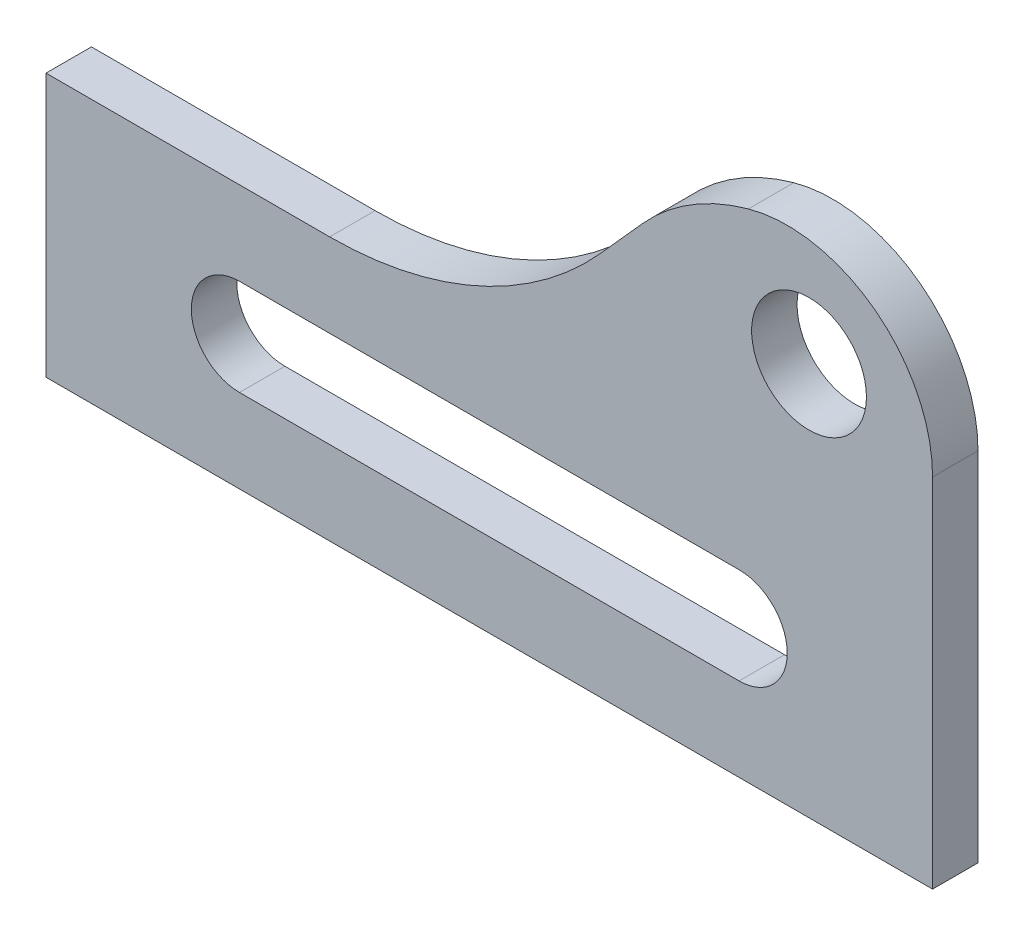
ISO-10303-21;
HEADER;
FILE_DESCRIPTION(('STEP AP214'),'2;1');
FILE_NAME('part.step','',(''),(''),'','','');
FILE_SCHEMA(('AUTOMOTIVE_DESIGN { 1 0 10303 214 1 1 1 1 }'));
ENDSEC;
DATA;
#1=APPLICATION_CONTEXT('core data for automotive mechanical design processes');
#2=APPLICATION_PROTOCOL_DEFINITION('international standard','automotive_design',2000,#1);
#3=PRODUCT_CONTEXT('',#1,'mechanical');
#4=PRODUCT('Part','Part','',(#3));
#5=PRODUCT_RELATED_PRODUCT_CATEGORY('part','',(#4));
#6=PRODUCT_DEFINITION_FORMATION('','',#4);
#7=PRODUCT_DEFINITION_CONTEXT('part definition',#1,'design');
#8=PRODUCT_DEFINITION('design','',#6,#7);
#9=PRODUCT_DEFINITION_SHAPE('','',#8);
#10=(LENGTH_UNIT() NAMED_UNIT(*) SI_UNIT(.MILLI.,.METRE.));
#11=(NAMED_UNIT(*) PLANE_ANGLE_UNIT() SI_UNIT($,.RADIAN.));
#12=(NAMED_UNIT(*) SI_UNIT($,.STERADIAN.) SOLID_ANGLE_UNIT());
#13=UNCERTAINTY_MEASURE_WITH_UNIT(LENGTH_MEASURE(1.E-05),#10,'distance_accuracy_value','');
#14=(GEOMETRIC_REPRESENTATION_CONTEXT(3) GLOBAL_UNCERTAINTY_ASSIGNED_CONTEXT((#13)) GLOBAL_UNIT_ASSIGNED_CONTEXT((#10,
#11,#12)) REPRESENTATION_CONTEXT('',''));
#15=CARTESIAN_POINT('',(0.,0.,0.));
#16=DIRECTION('',(0.,0.,1.));
#17=DIRECTION('',(1.,0.,0.));
#18=AXIS2_PLACEMENT_3D('',#15,#16,#17);
#19=CARTESIAN_POINT('',(0.,9.2075,1.5875));
#20=DIRECTION('',(0.,-1.,0.));
#21=DIRECTION('',(0.,0.,-1.));
#22=AXIS2_PLACEMENT_3D('',#19,#20,#21);
#23=PLANE('',#22);
#24=DIRECTION('',(-1.,0.,0.));
#25=VECTOR('',#24,1.);
#26=CARTESIAN_POINT('',(0.,9.2075,1.5875));
#27=LINE('',#26,#25);
#28=CARTESIAN_POINT('',(9.91586112190986,9.2075,1.5875));
#29=VERTEX_POINT('',#28);
#30=CARTESIAN_POINT('',(0.,9.2075,1.5875));
#31=VERTEX_POINT('',#30);
#32=EDGE_CURVE('E184',#29,#31,#27,.T.);
#33=ORIENTED_EDGE('',*,*,#32,.F.);
#34=DIRECTION('',(0.,0.,1.));
#35=VECTOR('',#34,1.);
#36=CARTESIAN_POINT('',(9.91586112190987,9.2075,1.5875));
#37=LINE('',#36,#35);
#38=CARTESIAN_POINT('',(9.91586112190986,9.2075,0.));
#39=VERTEX_POINT('',#38);
#40=EDGE_CURVE('E194',#29,#39,#37,.F.);
#41=ORIENTED_EDGE('',*,*,#40,.T.);
#42=DIRECTION('',(-1.,0.,0.));
#43=VECTOR('',#42,1.);
#44=CARTESIAN_POINT('',(0.,9.2075,0.));
#45=LINE('',#44,#43);
#46=CARTESIAN_POINT('',(0.,9.2075,0.));
#47=VERTEX_POINT('',#46);
#48=EDGE_CURVE('E179',#39,#47,#45,.T.);
#49=ORIENTED_EDGE('',*,*,#48,.T.);
#50=DIRECTION('',(0.,0.,-1.));
#51=VECTOR('',#50,1.);
#52=CARTESIAN_POINT('',(0.,9.2075,1.5875));
#53=LINE('',#52,#51);
#54=EDGE_CURVE('E191',#31,#47,#53,.T.);
#55=ORIENTED_EDGE('',*,*,#54,.F.);
#56=EDGE_LOOP('',(#33,#41,#49,#55));
#57=FACE_BOUND('',#56,.T.);
#58=ADVANCED_FACE('F35',(#57),#23,.F.);
#59=CARTESIAN_POINT('',(0.,0.,1.5875));
#60=DIRECTION('',(1.,0.,0.));
#61=DIRECTION('',(0.,0.,-1.));
#62=AXIS2_PLACEMENT_3D('',#59,#60,#61);
#63=PLANE('',#62);
#64=DIRECTION('',(0.,-1.,0.));
#65=VECTOR('',#64,1.);
#66=CARTESIAN_POINT('',(0.,0.,0.));
#67=LINE('',#66,#65);
#68=CARTESIAN_POINT('',(0.,0.,0.));
#69=VERTEX_POINT('',#68);
#70=EDGE_CURVE('E163',#47,#69,#67,.T.);
#71=ORIENTED_EDGE('',*,*,#70,.T.);
#72=DIRECTION('',(0.,0.,-1.));
#73=VECTOR('',#72,1.);
#74=CARTESIAN_POINT('',(0.,0.,1.5875));
#75=LINE('',#74,#73);
#76=CARTESIAN_POINT('',(0.,0.,1.5875));
#77=VERTEX_POINT('',#76);
#78=EDGE_CURVE('E235',#77,#69,#75,.T.);
#79=ORIENTED_EDGE('',*,*,#78,.F.);
#80=DIRECTION('',(0.,-1.,0.));
#81=VECTOR('',#80,1.);
#82=CARTESIAN_POINT('',(0.,0.,1.5875));
#83=LINE('',#82,#81);
#84=EDGE_CURVE('E175',#31,#77,#83,.T.);
#85=ORIENTED_EDGE('',*,*,#84,.F.);
#86=ORIENTED_EDGE('',*,*,#54,.T.);
#87=EDGE_LOOP('',(#71,#79,#85,#86));
#88=FACE_BOUND('',#87,.T.);
#89=ADVANCED_FACE('F265',(#88),#63,.F.);
#90=CARTESIAN_POINT('',(0.,0.,1.5875));
#91=DIRECTION('',(0.,1.,0.));
#92=DIRECTION('',(0.,0.,1.));
#93=AXIS2_PLACEMENT_3D('',#90,#91,#92);
#94=PLANE('',#93);
#95=DIRECTION('',(1.,0.,0.));
#96=VECTOR('',#95,1.);
#97=CARTESIAN_POINT('',(0.,0.,0.));
#98=LINE('',#97,#96);
#99=CARTESIAN_POINT('',(30.988,0.,0.));
#100=VERTEX_POINT('',#99);
#101=EDGE_CURVE('E234',#69,#100,#98,.T.);
#102=ORIENTED_EDGE('',*,*,#101,.T.);
#103=DIRECTION('',(0.,0.,-1.));
#104=VECTOR('',#103,1.);
#105=CARTESIAN_POINT('',(30.988,0.,1.5875));
#106=LINE('',#105,#104);
#107=CARTESIAN_POINT('',(30.988,0.,1.5875));
#108=VERTEX_POINT('',#107);
#109=EDGE_CURVE('E232',#108,#100,#106,.T.);
#110=ORIENTED_EDGE('',*,*,#109,.F.);
#111=DIRECTION('',(1.,0.,0.));
#112=VECTOR('',#111,1.);
#113=CARTESIAN_POINT('',(0.,0.,1.5875));
#114=LINE('',#113,#112);
#115=EDGE_CURVE('E178',#77,#108,#114,.T.);
#116=ORIENTED_EDGE('',*,*,#115,.F.);
#117=ORIENTED_EDGE('',*,*,#78,.T.);
#118=EDGE_LOOP('',(#102,#110,#116,#117));
#119=FACE_BOUND('',#118,.T.);
#120=ADVANCED_FACE('F233',(#119),#94,.F.);
#121=CARTESIAN_POINT('',(30.988,0.,1.5875));
#122=DIRECTION('',(-1.,0.,0.));
#123=DIRECTION('',(0.,0.,1.));
#124=AXIS2_PLACEMENT_3D('',#121,#122,#123);
#125=PLANE('',#124);
#126=DIRECTION('',(0.,1.,0.));
#127=VECTOR('',#126,1.);
#128=CARTESIAN_POINT('',(30.988,0.,0.));
#129=LINE('',#128,#127);
#130=CARTESIAN_POINT('',(30.988,12.4764438348202,0.));
#131=VERTEX_POINT('',#130);
#132=EDGE_CURVE('E223',#100,#131,#129,.T.);
#133=ORIENTED_EDGE('',*,*,#132,.T.);
#134=DIRECTION('',(0.,0.,-1.));
#135=VECTOR('',#134,1.);
#136=CARTESIAN_POINT('',(30.988,12.4764438348202,1.5875));
#137=LINE('',#136,#135);
#138=CARTESIAN_POINT('',(30.988,12.4764438348202,1.5875));
#139=VERTEX_POINT('',#138);
#140=EDGE_CURVE('E201',#131,#139,#137,.F.);
#141=ORIENTED_EDGE('',*,*,#140,.T.);
#142=DIRECTION('',(0.,1.,0.));
#143=VECTOR('',#142,1.);
#144=CARTESIAN_POINT('',(30.988,0.,1.5875));
#145=LINE('',#144,#143);
#146=EDGE_CURVE('E181',#108,#139,#145,.T.);
#147=ORIENTED_EDGE('',*,*,#146,.F.);
#148=ORIENTED_EDGE('',*,*,#109,.T.);
#149=EDGE_LOOP('',(#133,#141,#147,#148));
#150=FACE_BOUND('',#149,.T.);
#151=ADVANCED_FACE('F221',(#150),#125,.F.);
#152=CARTESIAN_POINT('',(0.,0.,1.5875));
#153=DIRECTION('',(0.,0.,-1.));
#154=DIRECTION('',(-1.,0.,0.));
#155=AXIS2_PLACEMENT_3D('',#152,#153,#154);
#156=PLANE('',#155);
#157=DIRECTION('',(1.,0.,0.));
#158=VECTOR('',#157,1.);
#159=CARTESIAN_POINT('',(6.76275,2.921,1.5875));
#160=LINE('',#159,#158);
#161=CARTESIAN_POINT('',(6.76275,2.921,1.5875));
#162=VERTEX_POINT('',#161);
#163=CARTESIAN_POINT('',(24.22525,2.921,1.5875));
#164=VERTEX_POINT('',#163);
#165=EDGE_CURVE('E150',#162,#164,#160,.T.);
#166=ORIENTED_EDGE('',*,*,#165,.F.);
#167=CARTESIAN_POINT('',(6.76275,4.60375,1.5875));
#168=DIRECTION('',(0.,0.,1.));
#169=DIRECTION('',(1.,0.,0.));
#170=AXIS2_PLACEMENT_3D('',#167,#168,#169);
#171=CIRCLE('',#170,1.68275);
#172=CARTESIAN_POINT('',(6.76275,6.2865,1.5875));
#173=VERTEX_POINT('',#172);
#174=EDGE_CURVE('E50',#173,#162,#171,.T.);
#175=ORIENTED_EDGE('',*,*,#174,.F.);
#176=DIRECTION('',(-1.,0.,0.));
#177=VECTOR('',#176,1.);
#178=CARTESIAN_POINT('',(6.76275,6.2865,1.5875));
#179=LINE('',#178,#177);
#180=CARTESIAN_POINT('',(24.22525,6.2865,1.5875));
#181=VERTEX_POINT('',#180);
#182=EDGE_CURVE('E141',#181,#173,#179,.T.);
#183=ORIENTED_EDGE('',*,*,#182,.F.);
#184=CARTESIAN_POINT('',(24.22525,4.60375,1.5875));
#185=DIRECTION('',(0.,0.,1.));
#186=DIRECTION('',(1.,0.,0.));
#187=AXIS2_PLACEMENT_3D('',#184,#185,#186);
#188=CIRCLE('',#187,1.68275);
#189=EDGE_CURVE('E144',#164,#181,#188,.T.);
#190=ORIENTED_EDGE('',*,*,#189,.F.);
#191=EDGE_LOOP('',(#166,#175,#183,#190));
#192=FACE_BOUND('',#191,.T.);
#193=ORIENTED_EDGE('',*,*,#146,.T.);
#194=CARTESIAN_POINT('',(25.908,12.4764438348202,1.5875));
#195=DIRECTION('',(0.,0.,-1.));
#196=DIRECTION('',(-1.,0.,0.));
#197=AXIS2_PLACEMENT_3D('',#194,#195,#196);
#198=CIRCLE('',#197,5.08);
#199=CARTESIAN_POINT('',(24.5503336267183,17.3716600730327,1.5875));
#200=VERTEX_POINT('',#199);
#201=EDGE_CURVE('E204',#139,#200,#198,.F.);
#202=ORIENTED_EDGE('',*,*,#201,.T.);
#203=CARTESIAN_POINT('',(26.625310634999,9.89010102086193,1.5875));
#204=DIRECTION('',(0.,0.,1.));
#205=DIRECTION('',(1.,0.,0.));
#206=AXIS2_PLACEMENT_3D('',#203,#204,#205);
#207=CIRCLE('',#206,7.76397162771815);
#208=CARTESIAN_POINT('',(20.843386501073,15.0716653353848,1.5875));
#209=VERTEX_POINT('',#208);
#210=EDGE_CURVE('E168',#200,#209,#207,.T.);
#211=ORIENTED_EDGE('',*,*,#210,.T.);
#212=DIRECTION('',(-0.667385786937201,-0.744712166809576,0.));
#213=VECTOR('',#212,1.);
#214=CARTESIAN_POINT('',(4.06889004285246,-3.64640125975596,1.5875));
#215=LINE('',#214,#213);
#216=CARTESIAN_POINT('',(19.3737056403915,13.4317005058976,1.5875));
#217=VERTEX_POINT('',#216);
#218=EDGE_CURVE('E170',#209,#217,#215,.T.);
#219=ORIENTED_EDGE('',*,*,#218,.T.);
#220=CARTESIAN_POINT('',(9.91586112190987,21.9075,1.5875));
#221=DIRECTION('',(0.,0.,-1.));
#222=DIRECTION('',(-1.,0.,0.));
#223=AXIS2_PLACEMENT_3D('',#220,#221,#222);
#224=CIRCLE('',#223,12.7);
#225=EDGE_CURVE('E196',#217,#29,#224,.T.);
#226=ORIENTED_EDGE('',*,*,#225,.T.);
#227=ORIENTED_EDGE('',*,*,#32,.T.);
#228=ORIENTED_EDGE('',*,*,#84,.T.);
#229=ORIENTED_EDGE('',*,*,#115,.T.);
#230=EDGE_LOOP('',(#193,#202,#211,#219,#226,#227,#228,#229));
#231=FACE_BOUND('',#230,.T.);
#232=CARTESIAN_POINT('',(26.6699999999999,13.7423440316827,1.5875));
#233=DIRECTION('',(0.,0.,1.));
#234=DIRECTION('',(1.,0.,0.));
#235=AXIS2_PLACEMENT_3D('',#232,#233,#234);
#236=CIRCLE('',#235,2.00660000000004);
#237=CARTESIAN_POINT('',(28.6765999999999,13.7423440316827,1.5875));
#238=VERTEX_POINT('',#237);
#239=EDGE_CURVE('E165',#238,#238,#236,.T.);
#240=ORIENTED_EDGE('',*,*,#239,.F.);
#241=EDGE_LOOP('',(#240));
#242=FACE_BOUND('',#241,.T.);
#243=ADVANCED_FACE('F225',(#192,#231,#242),#156,.F.);
#244=CARTESIAN_POINT('',(0.,0.,0.));
#245=DIRECTION('',(0.,0.,-1.));
#246=DIRECTION('',(-1.,0.,0.));
#247=AXIS2_PLACEMENT_3D('',#244,#245,#246);
#248=PLANE('',#247);
#249=CARTESIAN_POINT('',(6.76275,4.60375,0.));
#250=DIRECTION('',(0.,0.,1.));
#251=DIRECTION('',(1.,0.,0.));
#252=AXIS2_PLACEMENT_3D('',#249,#250,#251);
#253=CIRCLE('',#252,1.68275);
#254=CARTESIAN_POINT('',(6.76275,6.2865,0.));
#255=VERTEX_POINT('',#254);
#256=CARTESIAN_POINT('',(6.76275,2.921,0.));
#257=VERTEX_POINT('',#256);
#258=EDGE_CURVE('E125',#255,#257,#253,.T.);
#259=ORIENTED_EDGE('',*,*,#258,.T.);
#260=DIRECTION('',(1.,0.,0.));
#261=VECTOR('',#260,1.);
#262=CARTESIAN_POINT('',(6.76275,2.921,0.));
#263=LINE('',#262,#261);
#264=CARTESIAN_POINT('',(24.22525,2.921,0.));
#265=VERTEX_POINT('',#264);
#266=EDGE_CURVE('E134',#257,#265,#263,.T.);
#267=ORIENTED_EDGE('',*,*,#266,.T.);
#268=CARTESIAN_POINT('',(24.22525,4.60375,0.));
#269=DIRECTION('',(0.,0.,1.));
#270=DIRECTION('',(1.,0.,0.));
#271=AXIS2_PLACEMENT_3D('',#268,#269,#270);
#272=CIRCLE('',#271,1.68275);
#273=CARTESIAN_POINT('',(24.22525,6.2865,0.));
#274=VERTEX_POINT('',#273);
#275=EDGE_CURVE('E58',#265,#274,#272,.T.);
#276=ORIENTED_EDGE('',*,*,#275,.T.);
#277=DIRECTION('',(-1.,0.,0.));
#278=VECTOR('',#277,1.);
#279=CARTESIAN_POINT('',(6.76275,6.2865,0.));
#280=LINE('',#279,#278);
#281=EDGE_CURVE('E131',#274,#255,#280,.T.);
#282=ORIENTED_EDGE('',*,*,#281,.T.);
#283=EDGE_LOOP('',(#259,#267,#276,#282));
#284=FACE_BOUND('',#283,.T.);
#285=CARTESIAN_POINT('',(26.625310634999,9.89010102086193,0.));
#286=DIRECTION('',(0.,0.,-1.));
#287=DIRECTION('',(-1.,0.,0.));
#288=AXIS2_PLACEMENT_3D('',#285,#286,#287);
#289=CIRCLE('',#288,7.76397162771815);
#290=CARTESIAN_POINT('',(24.5503336267183,17.3716600730327,0.));
#291=VERTEX_POINT('',#290);
#292=CARTESIAN_POINT('',(20.843386501073,15.0716653353848,0.));
#293=VERTEX_POINT('',#292);
#294=EDGE_CURVE('E164',#291,#293,#289,.F.);
#295=ORIENTED_EDGE('',*,*,#294,.F.);
#296=CARTESIAN_POINT('',(25.908,12.4764438348202,0.));
#297=DIRECTION('',(0.,0.,-1.));
#298=DIRECTION('',(-1.,0.,0.));
#299=AXIS2_PLACEMENT_3D('',#296,#297,#298);
#300=CIRCLE('',#299,5.08);
#301=EDGE_CURVE('E11',#291,#131,#300,.T.);
#302=ORIENTED_EDGE('',*,*,#301,.T.);
#303=ORIENTED_EDGE('',*,*,#132,.F.);
#304=ORIENTED_EDGE('',*,*,#101,.F.);
#305=ORIENTED_EDGE('',*,*,#70,.F.);
#306=ORIENTED_EDGE('',*,*,#48,.F.);
#307=CARTESIAN_POINT('',(9.91586112190987,21.9075,0.));
#308=DIRECTION('',(0.,0.,-1.));
#309=DIRECTION('',(-1.,0.,0.));
#310=AXIS2_PLACEMENT_3D('',#307,#308,#309);
#311=CIRCLE('',#310,12.7);
#312=CARTESIAN_POINT('',(19.3737056403915,13.4317005058976,0.));
#313=VERTEX_POINT('',#312);
#314=EDGE_CURVE('E199',#39,#313,#311,.F.);
#315=ORIENTED_EDGE('',*,*,#314,.T.);
#316=DIRECTION('',(-0.667385786937201,-0.744712166809576,0.));
#317=VECTOR('',#316,1.);
#318=CARTESIAN_POINT('',(4.06889004285246,-3.64640125975596,0.));
#319=LINE('',#318,#317);
#320=EDGE_CURVE('E156',#293,#313,#319,.T.);
#321=ORIENTED_EDGE('',*,*,#320,.F.);
#322=EDGE_LOOP('',(#295,#302,#303,#304,#305,#306,#315,#321));
#323=FACE_BOUND('',#322,.T.);
#324=CARTESIAN_POINT('',(26.6699999999999,13.7423440316827,0.));
#325=DIRECTION('',(0.,0.,-1.));
#326=DIRECTION('',(-1.,0.,0.));
#327=AXIS2_PLACEMENT_3D('',#324,#325,#326);
#328=CIRCLE('',#327,2.00660000000004);
#329=CARTESIAN_POINT('',(24.6633999999998,13.7423440316827,0.));
#330=VERTEX_POINT('',#329);
#331=EDGE_CURVE('E160',#330,#330,#328,.F.);
#332=ORIENTED_EDGE('',*,*,#331,.T.);
#333=EDGE_LOOP('',(#332));
#334=FACE_BOUND('',#333,.T.);
#335=ADVANCED_FACE('F138',(#284,#323,#334),#248,.T.);
#336=CARTESIAN_POINT('',(26.6699999999999,13.7423440316827,-17.5641931457976));
#337=DIRECTION('',(0.,0.,1.));
#338=DIRECTION('',(1.,0.,0.));
#339=AXIS2_PLACEMENT_3D('',#336,#337,#338);
#340=CYLINDRICAL_SURFACE('',#339,2.00660000000004);
#341=ORIENTED_EDGE('',*,*,#239,.T.);
#342=EDGE_LOOP('',(#341));
#343=FACE_BOUND('',#342,.T.);
#344=ORIENTED_EDGE('',*,*,#331,.F.);
#345=EDGE_LOOP('',(#344));
#346=FACE_BOUND('',#345,.T.);
#347=ADVANCED_FACE('F284',(#343,#346),#340,.F.);
#348=CARTESIAN_POINT('',(26.625310634999,9.89010102086193,-17.5641931457976));
#349=DIRECTION('',(0.,0.,1.));
#350=DIRECTION('',(1.,0.,0.));
#351=AXIS2_PLACEMENT_3D('',#348,#349,#350);
#352=CYLINDRICAL_SURFACE('',#351,7.76397162771815);
#353=ORIENTED_EDGE('',*,*,#210,.F.);
#354=DIRECTION('',(0.,0.,1.));
#355=VECTOR('',#354,1.);
#356=CARTESIAN_POINT('',(24.5503336267183,17.3716600730327,-17.5641931457976));
#357=LINE('',#356,#355);
#358=EDGE_CURVE('E43',#200,#291,#357,.F.);
#359=ORIENTED_EDGE('',*,*,#358,.T.);
#360=ORIENTED_EDGE('',*,*,#294,.T.);
#361=DIRECTION('',(0.,0.,1.));
#362=VECTOR('',#361,1.);
#363=CARTESIAN_POINT('',(20.843386501073,15.0716653353848,-17.5641931457976));
#364=LINE('',#363,#362);
#365=EDGE_CURVE('E171',#293,#209,#364,.T.);
#366=ORIENTED_EDGE('',*,*,#365,.T.);
#367=EDGE_LOOP('',(#353,#359,#360,#366));
#368=FACE_BOUND('',#367,.T.);
#369=ADVANCED_FACE('F209',(#368),#352,.T.);
#370=CARTESIAN_POINT('',(4.06889004285246,-3.64640125975596,-17.5641931457976));
#371=DIRECTION('',(-0.744712166809576,0.667385786937201,0.));
#372=DIRECTION('',(-0.667385786937201,-0.744712166809576,0.));
#373=AXIS2_PLACEMENT_3D('',#370,#371,#372);
#374=PLANE('',#373);
#375=ORIENTED_EDGE('',*,*,#320,.T.);
#376=DIRECTION('',(0.,0.,1.));
#377=VECTOR('',#376,1.);
#378=CARTESIAN_POINT('',(19.3737056403915,13.4317005058976,-17.5641931457976));
#379=LINE('',#378,#377);
#380=EDGE_CURVE('E197',#313,#217,#379,.T.);
#381=ORIENTED_EDGE('',*,*,#380,.T.);
#382=ORIENTED_EDGE('',*,*,#218,.F.);
#383=ORIENTED_EDGE('',*,*,#365,.F.);
#384=EDGE_LOOP('',(#375,#381,#382,#383));
#385=FACE_BOUND('',#384,.T.);
#386=ADVANCED_FACE('F251',(#385),#374,.T.);
#387=CARTESIAN_POINT('',(9.91586112190987,21.9075,-17.5641931457976));
#388=DIRECTION('',(0.,0.,1.));
#389=DIRECTION('',(1.,0.,0.));
#390=AXIS2_PLACEMENT_3D('',#387,#388,#389);
#391=CYLINDRICAL_SURFACE('',#390,12.7);
#392=ORIENTED_EDGE('',*,*,#314,.F.);
#393=ORIENTED_EDGE('',*,*,#40,.F.);
#394=ORIENTED_EDGE('',*,*,#225,.F.);
#395=ORIENTED_EDGE('',*,*,#380,.F.);
#396=EDGE_LOOP('',(#392,#393,#394,#395));
#397=FACE_BOUND('',#396,.T.);
#398=ADVANCED_FACE('F259',(#397),#391,.F.);
#399=CARTESIAN_POINT('',(25.908,12.4764438348202,-17.5641931457976));
#400=DIRECTION('',(0.,0.,1.));
#401=DIRECTION('',(1.,0.,0.));
#402=AXIS2_PLACEMENT_3D('',#399,#400,#401);
#403=CYLINDRICAL_SURFACE('',#402,5.08);
#404=ORIENTED_EDGE('',*,*,#301,.F.);
#405=ORIENTED_EDGE('',*,*,#358,.F.);
#406=ORIENTED_EDGE('',*,*,#201,.F.);
#407=ORIENTED_EDGE('',*,*,#140,.F.);
#408=EDGE_LOOP('',(#404,#405,#406,#407));
#409=FACE_BOUND('',#408,.T.);
#410=ADVANCED_FACE('F37',(#409),#403,.T.);
#411=CARTESIAN_POINT('',(6.76275,4.60375,0.));
#412=DIRECTION('',(0.,0.,1.));
#413=DIRECTION('',(1.,0.,0.));
#414=AXIS2_PLACEMENT_3D('',#411,#412,#413);
#415=CYLINDRICAL_SURFACE('',#414,1.68275);
#416=ORIENTED_EDGE('',*,*,#174,.T.);
#417=DIRECTION('',(0.,0.,1.));
#418=VECTOR('',#417,1.);
#419=CARTESIAN_POINT('',(6.76275,2.921,0.));
#420=LINE('',#419,#418);
#421=EDGE_CURVE('E121',#257,#162,#420,.T.);
#422=ORIENTED_EDGE('',*,*,#421,.F.);
#423=ORIENTED_EDGE('',*,*,#258,.F.);
#424=DIRECTION('',(0.,0.,1.));
#425=VECTOR('',#424,1.);
#426=CARTESIAN_POINT('',(6.76275,6.2865,0.));
#427=LINE('',#426,#425);
#428=EDGE_CURVE('E154',#255,#173,#427,.T.);
#429=ORIENTED_EDGE('',*,*,#428,.T.);
#430=EDGE_LOOP('',(#416,#422,#423,#429));
#431=FACE_BOUND('',#430,.T.);
#432=ADVANCED_FACE('F123',(#431),#415,.F.);
#433=CARTESIAN_POINT('',(6.76275,6.2865,0.));
#434=DIRECTION('',(0.,1.,0.));
#435=DIRECTION('',(0.,0.,1.));
#436=AXIS2_PLACEMENT_3D('',#433,#434,#435);
#437=PLANE('',#436);
#438=ORIENTED_EDGE('',*,*,#182,.T.);
#439=ORIENTED_EDGE('',*,*,#428,.F.);
#440=ORIENTED_EDGE('',*,*,#281,.F.);
#441=DIRECTION('',(0.,0.,1.));
#442=VECTOR('',#441,1.);
#443=CARTESIAN_POINT('',(24.22525,6.2865,0.));
#444=LINE('',#443,#442);
#445=EDGE_CURVE('E157',#274,#181,#444,.T.);
#446=ORIENTED_EDGE('',*,*,#445,.T.);
#447=EDGE_LOOP('',(#438,#439,#440,#446));
#448=FACE_BOUND('',#447,.T.);
#449=ADVANCED_FACE('F335',(#448),#437,.F.);
#450=CARTESIAN_POINT('',(24.22525,4.60375,0.));
#451=DIRECTION('',(0.,0.,1.));
#452=DIRECTION('',(1.,0.,0.));
#453=AXIS2_PLACEMENT_3D('',#450,#451,#452);
#454=CYLINDRICAL_SURFACE('',#453,1.68275);
#455=ORIENTED_EDGE('',*,*,#189,.T.);
#456=ORIENTED_EDGE('',*,*,#445,.F.);
#457=ORIENTED_EDGE('',*,*,#275,.F.);
#458=DIRECTION('',(0.,0.,1.));
#459=VECTOR('',#458,1.);
#460=CARTESIAN_POINT('',(24.22525,2.921,0.));
#461=LINE('',#460,#459);
#462=EDGE_CURVE('E130',#265,#164,#461,.T.);
#463=ORIENTED_EDGE('',*,*,#462,.T.);
#464=EDGE_LOOP('',(#455,#456,#457,#463));
#465=FACE_BOUND('',#464,.T.);
#466=ADVANCED_FACE('F340',(#465),#454,.F.);
#467=CARTESIAN_POINT('',(6.76275,2.921,0.));
#468=DIRECTION('',(0.,-1.,0.));
#469=DIRECTION('',(0.,0.,-1.));
#470=AXIS2_PLACEMENT_3D('',#467,#468,#469);
#471=PLANE('',#470);
#472=ORIENTED_EDGE('',*,*,#165,.T.);
#473=ORIENTED_EDGE('',*,*,#462,.F.);
#474=ORIENTED_EDGE('',*,*,#266,.F.);
#475=ORIENTED_EDGE('',*,*,#421,.T.);
#476=EDGE_LOOP('',(#472,#473,#474,#475));
#477=FACE_BOUND('',#476,.T.);
#478=ADVANCED_FACE('F135',(#477),#471,.F.);
#479=CLOSED_SHELL('',(#58,#89,#120,#151,#243,#335,#347,#369,#386,#398,#410,#432,#449,#466,#478));
#480=MANIFOLD_SOLID_BREP('B2',#479);
#481=ADVANCED_BREP_SHAPE_REPRESENTATION('',(#18,#480),#14);
#482=SHAPE_DEFINITION_REPRESENTATION(#9,#481);
ENDSEC;
END-ISO-10303-21;
